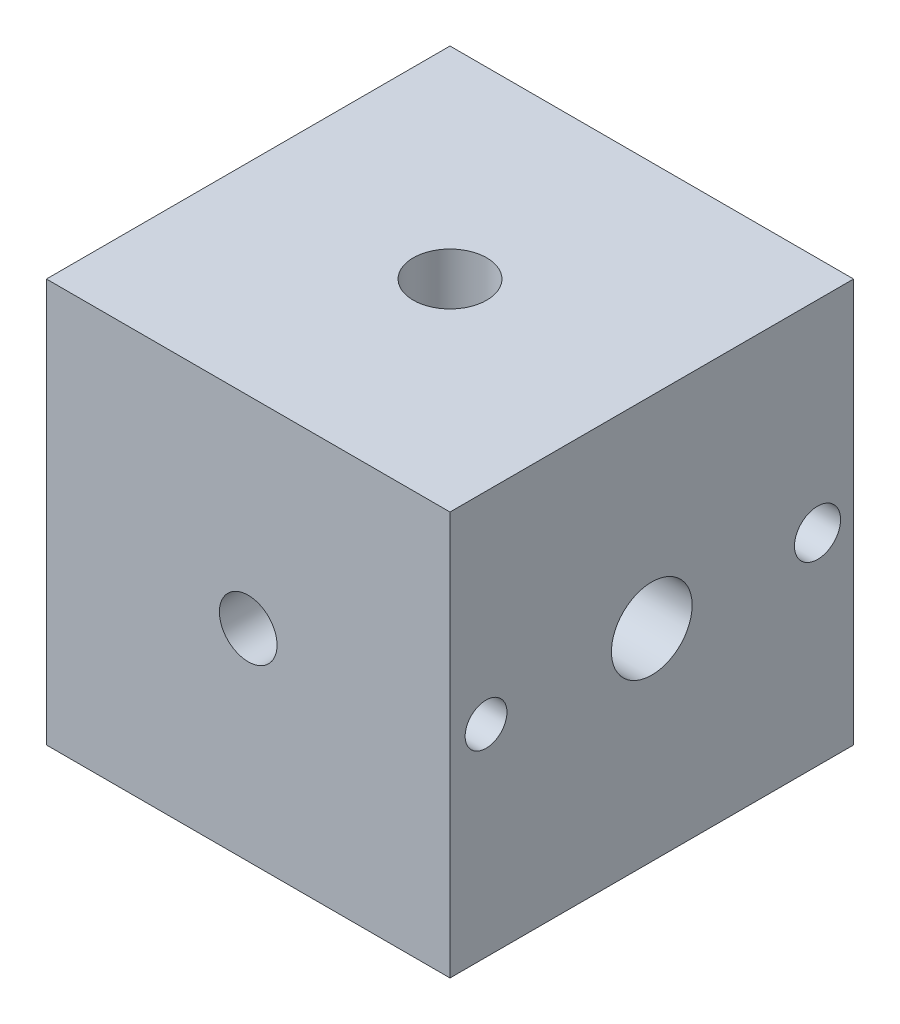
ISO-10303-21;
HEADER;
FILE_DESCRIPTION(('STEP AP214'),'2;1');
FILE_NAME('part.step','',(''),(''),'','','');
FILE_SCHEMA(('AUTOMOTIVE_DESIGN { 1 0 10303 214 1 1 1 1 }'));
ENDSEC;
DATA;
#1=APPLICATION_CONTEXT('core data for automotive mechanical design processes');
#2=APPLICATION_PROTOCOL_DEFINITION('international standard','automotive_design',2000,#1);
#3=PRODUCT_CONTEXT('',#1,'mechanical');
#4=PRODUCT('Part','Part','',(#3));
#5=PRODUCT_RELATED_PRODUCT_CATEGORY('part','',(#4));
#6=PRODUCT_DEFINITION_FORMATION('','',#4);
#7=PRODUCT_DEFINITION_CONTEXT('part definition',#1,'design');
#8=PRODUCT_DEFINITION('design','',#6,#7);
#9=PRODUCT_DEFINITION_SHAPE('','',#8);
#10=(LENGTH_UNIT() NAMED_UNIT(*) SI_UNIT(.MILLI.,.METRE.));
#11=(NAMED_UNIT(*) PLANE_ANGLE_UNIT() SI_UNIT($,.RADIAN.));
#12=(NAMED_UNIT(*) SI_UNIT($,.STERADIAN.) SOLID_ANGLE_UNIT());
#13=UNCERTAINTY_MEASURE_WITH_UNIT(LENGTH_MEASURE(1.E-05),#10,'distance_accuracy_value','');
#14=(GEOMETRIC_REPRESENTATION_CONTEXT(3) GLOBAL_UNCERTAINTY_ASSIGNED_CONTEXT((#13)) GLOBAL_UNIT_ASSIGNED_CONTEXT((#10,
#11,#12)) REPRESENTATION_CONTEXT('',''));
#15=CARTESIAN_POINT('',(0.,0.,0.));
#16=DIRECTION('',(0.,0.,1.));
#17=DIRECTION('',(1.,0.,0.));
#18=AXIS2_PLACEMENT_3D('',#15,#16,#17);
#19=CARTESIAN_POINT('',(8.,0.,11.5));
#20=DIRECTION('',(1.,0.,0.));
#21=DIRECTION('',(0.,1.,0.));
#22=AXIS2_PLACEMENT_3D('',#19,#20,#21);
#23=PLANE('',#22);
#24=CARTESIAN_POINT('',(8.,0.,11.5));
#25=DIRECTION('',(1.,0.,0.));
#26=DIRECTION('',(0.,0.,-1.));
#27=AXIS2_PLACEMENT_3D('',#24,#25,#26);
#28=CIRCLE('',#27,1.45);
#29=CARTESIAN_POINT('',(8.,0.,10.05));
#30=VERTEX_POINT('',#29);
#31=EDGE_CURVE('E11',#30,#30,#28,.T.);
#32=ORIENTED_EDGE('',*,*,#31,.T.);
#33=EDGE_LOOP('',(#32));
#34=FACE_BOUND('',#33,.T.);
#35=ADVANCED_FACE('F17',(#34),#23,.T.);
#36=CARTESIAN_POINT('',(6.,0.,0.));
#37=DIRECTION('',(1.,0.,0.));
#38=DIRECTION('',(0.,1.,0.));
#39=AXIS2_PLACEMENT_3D('',#36,#37,#38);
#40=PLANE('',#39);
#41=CARTESIAN_POINT('',(6.,0.,0.));
#42=DIRECTION('',(1.,0.,0.));
#43=DIRECTION('',(0.,0.,-1.));
#44=AXIS2_PLACEMENT_3D('',#41,#42,#43);
#45=CIRCLE('',#44,2.8);
#46=CARTESIAN_POINT('',(6.,0.,-2.8));
#47=VERTEX_POINT('',#46);
#48=EDGE_CURVE('E28',#47,#47,#45,.T.);
#49=ORIENTED_EDGE('',*,*,#48,.T.);
#50=EDGE_LOOP('',(#49));
#51=FACE_BOUND('',#50,.T.);
#52=ADVANCED_FACE('F279',(#51),#40,.T.);
#53=CARTESIAN_POINT('',(8.,0.,-11.5));
#54=DIRECTION('',(1.,0.,0.));
#55=DIRECTION('',(0.,1.,0.));
#56=AXIS2_PLACEMENT_3D('',#53,#54,#55);
#57=PLANE('',#56);
#58=CARTESIAN_POINT('',(8.,0.,-11.5));
#59=DIRECTION('',(1.,0.,0.));
#60=DIRECTION('',(0.,0.,-1.));
#61=AXIS2_PLACEMENT_3D('',#58,#59,#60);
#62=CIRCLE('',#61,1.6);
#63=CARTESIAN_POINT('',(8.,0.,-13.1));
#64=VERTEX_POINT('',#63);
#65=EDGE_CURVE('E209',#64,#64,#62,.T.);
#66=ORIENTED_EDGE('',*,*,#65,.T.);
#67=EDGE_LOOP('',(#66));
#68=FACE_BOUND('',#67,.T.);
#69=ADVANCED_FACE('F284',(#68),#57,.T.);
#70=CARTESIAN_POINT('',(0.,0.,1.995));
#71=DIRECTION('',(0.,0.,1.));
#72=DIRECTION('',(1.,0.,0.));
#73=AXIS2_PLACEMENT_3D('',#70,#71,#72);
#74=PLANE('',#73);
#75=DIRECTION('',(0.,-1.,0.));
#76=VECTOR('',#75,1.);
#77=CARTESIAN_POINT('',(-1.58823014705,28.,1.995));
#78=LINE('',#77,#76);
#79=CARTESIAN_POINT('',(-1.58823014705,1.215534861697,1.995));
#80=VERTEX_POINT('',#79);
#81=CARTESIAN_POINT('',(-1.58823014705,-1.215534861697,1.995));
#82=VERTEX_POINT('',#81);
#83=EDGE_CURVE('E199',#80,#82,#78,.T.);
#84=ORIENTED_EDGE('',*,*,#83,.F.);
#85=CARTESIAN_POINT('',(0.,0.,1.995));
#86=DIRECTION('',(0.,0.,1.));
#87=DIRECTION('',(1.,0.,0.));
#88=AXIS2_PLACEMENT_3D('',#85,#86,#87);
#89=CIRCLE('',#88,2.);
#90=EDGE_CURVE('E40',#80,#82,#89,.T.);
#91=ORIENTED_EDGE('',*,*,#90,.T.);
#92=EDGE_LOOP('',(#84,#91));
#93=FACE_BOUND('',#92,.T.);
#94=ADVANCED_FACE('F300',(#93),#74,.T.);
#95=CARTESIAN_POINT('',(0.,0.,1.995));
#96=DIRECTION('',(0.,0.,1.));
#97=DIRECTION('',(1.,0.,0.));
#98=AXIS2_PLACEMENT_3D('',#95,#96,#97);
#99=PLANE('',#98);
#100=CARTESIAN_POINT('',(0.,0.,1.995));
#101=DIRECTION('',(0.,0.,1.));
#102=DIRECTION('',(1.,0.,0.));
#103=AXIS2_PLACEMENT_3D('',#100,#101,#102);
#104=CIRCLE('',#103,2.);
#105=CARTESIAN_POINT('',(1.58823014705,-1.215534861697,1.995));
#106=VERTEX_POINT('',#105);
#107=CARTESIAN_POINT('',(1.58823014705,1.215534861697,1.995));
#108=VERTEX_POINT('',#107);
#109=EDGE_CURVE('E204',#106,#108,#104,.T.);
#110=ORIENTED_EDGE('',*,*,#109,.T.);
#111=DIRECTION('',(0.,-1.,0.));
#112=VECTOR('',#111,1.);
#113=CARTESIAN_POINT('',(1.58823014705,28.,1.995));
#114=LINE('',#113,#112);
#115=EDGE_CURVE('E156',#108,#106,#114,.T.);
#116=ORIENTED_EDGE('',*,*,#115,.T.);
#117=EDGE_LOOP('',(#110,#116));
#118=FACE_BOUND('',#117,.T.);
#119=ADVANCED_FACE('F230',(#118),#99,.T.);
#120=CARTESIAN_POINT('',(8.,0.,11.5));
#121=DIRECTION('',(1.,0.,0.));
#122=DIRECTION('',(0.,0.,-1.));
#123=AXIS2_PLACEMENT_3D('',#120,#121,#122);
#124=CYLINDRICAL_SURFACE('',#123,1.45);
#125=CARTESIAN_POINT('',(14.,0.,11.5));
#126=DIRECTION('',(1.,0.,0.));
#127=DIRECTION('',(0.,0.,-1.));
#128=AXIS2_PLACEMENT_3D('',#125,#126,#127);
#129=CIRCLE('',#128,1.45);
#130=CARTESIAN_POINT('',(14.,0.,10.05));
#131=VERTEX_POINT('',#130);
#132=EDGE_CURVE('E160',#131,#131,#129,.T.);
#133=ORIENTED_EDGE('',*,*,#132,.T.);
#134=EDGE_LOOP('',(#133));
#135=FACE_BOUND('',#134,.T.);
#136=ORIENTED_EDGE('',*,*,#31,.F.);
#137=EDGE_LOOP('',(#136));
#138=FACE_BOUND('',#137,.T.);
#139=ADVANCED_FACE('F288',(#135,#138),#124,.F.);
#140=CARTESIAN_POINT('',(6.,0.,0.));
#141=DIRECTION('',(1.,0.,0.));
#142=DIRECTION('',(0.,0.,-1.));
#143=AXIS2_PLACEMENT_3D('',#140,#141,#142);
#144=CYLINDRICAL_SURFACE('',#143,2.8);
#145=CARTESIAN_POINT('',(14.,0.,0.));
#146=DIRECTION('',(1.,0.,0.));
#147=DIRECTION('',(0.,0.,-1.));
#148=AXIS2_PLACEMENT_3D('',#145,#146,#147);
#149=CIRCLE('',#148,2.8);
#150=CARTESIAN_POINT('',(14.,0.,-2.8));
#151=VERTEX_POINT('',#150);
#152=EDGE_CURVE('E192',#151,#151,#149,.T.);
#153=ORIENTED_EDGE('',*,*,#152,.T.);
#154=EDGE_LOOP('',(#153));
#155=FACE_BOUND('',#154,.T.);
#156=ORIENTED_EDGE('',*,*,#48,.F.);
#157=EDGE_LOOP('',(#156));
#158=FACE_BOUND('',#157,.T.);
#159=ADVANCED_FACE('F290',(#155,#158),#144,.F.);
#160=CARTESIAN_POINT('',(8.,0.,-11.5));
#161=DIRECTION('',(1.,0.,0.));
#162=DIRECTION('',(0.,0.,-1.));
#163=AXIS2_PLACEMENT_3D('',#160,#161,#162);
#164=CYLINDRICAL_SURFACE('',#163,1.6);
#165=CARTESIAN_POINT('',(14.,0.,-11.5));
#166=DIRECTION('',(1.,0.,0.));
#167=DIRECTION('',(0.,0.,-1.));
#168=AXIS2_PLACEMENT_3D('',#165,#166,#167);
#169=CIRCLE('',#168,1.6);
#170=CARTESIAN_POINT('',(14.,0.,-13.1));
#171=VERTEX_POINT('',#170);
#172=EDGE_CURVE('E188',#171,#171,#169,.T.);
#173=ORIENTED_EDGE('',*,*,#172,.T.);
#174=EDGE_LOOP('',(#173));
#175=FACE_BOUND('',#174,.T.);
#176=ORIENTED_EDGE('',*,*,#65,.F.);
#177=EDGE_LOOP('',(#176));
#178=FACE_BOUND('',#177,.T.);
#179=ADVANCED_FACE('F297',(#175,#178),#164,.F.);
#180=CARTESIAN_POINT('',(-8.,0.,11.5));
#181=DIRECTION('',(1.,0.,0.));
#182=DIRECTION('',(0.,1.,0.));
#183=AXIS2_PLACEMENT_3D('',#180,#181,#182);
#184=PLANE('',#183);
#185=CARTESIAN_POINT('',(-8.,0.,11.5));
#186=DIRECTION('',(1.,0.,0.));
#187=DIRECTION('',(0.,0.,-1.));
#188=AXIS2_PLACEMENT_3D('',#185,#186,#187);
#189=CIRCLE('',#188,1.45);
#190=CARTESIAN_POINT('',(-8.,0.,10.05));
#191=VERTEX_POINT('',#190);
#192=EDGE_CURVE('E184',#191,#191,#189,.T.);
#193=ORIENTED_EDGE('',*,*,#192,.F.);
#194=EDGE_LOOP('',(#193));
#195=FACE_BOUND('',#194,.T.);
#196=ADVANCED_FACE('F313',(#195),#184,.F.);
#197=CARTESIAN_POINT('',(-6.,0.,0.));
#198=DIRECTION('',(1.,0.,0.));
#199=DIRECTION('',(0.,1.,0.));
#200=AXIS2_PLACEMENT_3D('',#197,#198,#199);
#201=PLANE('',#200);
#202=CARTESIAN_POINT('',(-6.,0.,0.));
#203=DIRECTION('',(1.,0.,0.));
#204=DIRECTION('',(0.,0.,-1.));
#205=AXIS2_PLACEMENT_3D('',#202,#203,#204);
#206=CIRCLE('',#205,2.8);
#207=CARTESIAN_POINT('',(-6.,0.,-2.8));
#208=VERTEX_POINT('',#207);
#209=EDGE_CURVE('E180',#208,#208,#206,.T.);
#210=ORIENTED_EDGE('',*,*,#209,.F.);
#211=EDGE_LOOP('',(#210));
#212=FACE_BOUND('',#211,.T.);
#213=ADVANCED_FACE('F273',(#212),#201,.F.);
#214=CARTESIAN_POINT('',(-8.,0.,-11.5));
#215=DIRECTION('',(1.,0.,0.));
#216=DIRECTION('',(0.,1.,0.));
#217=AXIS2_PLACEMENT_3D('',#214,#215,#216);
#218=PLANE('',#217);
#219=CARTESIAN_POINT('',(-8.,0.,-11.5));
#220=DIRECTION('',(1.,0.,0.));
#221=DIRECTION('',(0.,0.,-1.));
#222=AXIS2_PLACEMENT_3D('',#219,#220,#221);
#223=CIRCLE('',#222,1.6);
#224=CARTESIAN_POINT('',(-8.,0.,-13.1));
#225=VERTEX_POINT('',#224);
#226=EDGE_CURVE('E176',#225,#225,#223,.T.);
#227=ORIENTED_EDGE('',*,*,#226,.F.);
#228=EDGE_LOOP('',(#227));
#229=FACE_BOUND('',#228,.T.);
#230=ADVANCED_FACE('F262',(#229),#218,.F.);
#231=CARTESIAN_POINT('',(0.,0.,1.995));
#232=DIRECTION('',(0.,0.,1.));
#233=DIRECTION('',(1.,0.,0.));
#234=AXIS2_PLACEMENT_3D('',#231,#232,#233);
#235=CYLINDRICAL_SURFACE('',#234,2.);
#236=CARTESIAN_POINT('',(0.,0.,14.));
#237=DIRECTION('',(0.,0.,1.));
#238=DIRECTION('',(1.,0.,0.));
#239=AXIS2_PLACEMENT_3D('',#236,#237,#238);
#240=CIRCLE('',#239,2.);
#241=CARTESIAN_POINT('',(2.,0.,14.));
#242=VERTEX_POINT('',#241);
#243=EDGE_CURVE('E144',#242,#242,#240,.T.);
#244=ORIENTED_EDGE('',*,*,#243,.T.);
#245=EDGE_LOOP('',(#244));
#246=FACE_BOUND('',#245,.T.);
#247=CARTESIAN_POINT('',(1.588230900719,1.215533876945,1.9949994));
#248=CARTESIAN_POINT('',(1.493312807921,1.339554976545,2.070564258826));
#249=CARTESIAN_POINT('',(1.385431224227,1.456436773732,2.147595542997));
#250=CARTESIAN_POINT('',(1.263773072387,1.565953731919,2.223715300103));
#251=CARTESIAN_POINT('',(1.127135862466,1.666765698737,2.296627463782));
#252=CARTESIAN_POINT('',(0.974332047042,1.756407367835,2.363280245736));
#253=CARTESIAN_POINT('',(0.759806532102,1.850705495804,2.434634173071));
#254=CARTESIAN_POINT('',(0.713642348034,1.869413645077,2.448873442039));
#255=CARTESIAN_POINT('',(0.666356309088,1.886955096084,2.462293341311));
#256=CARTESIAN_POINT('',(0.617990242128,1.903240429293,2.474807618467));
#257=CARTESIAN_POINT('',(0.568590419616,1.918183007082,2.486333186612));
#258=CARTESIAN_POINT('',(0.43653866828,1.953607893015,2.513740462512));
#259=CARTESIAN_POINT('',(0.352162802534,1.971801259837,2.527909039614));
#260=CARTESIAN_POINT('',(0.265680808194,1.985793325601,2.538857059869));
#261=CARTESIAN_POINT('',(0.177724418329,1.995253066588,2.546277216925));
#262=CARTESIAN_POINT('',(0.08894461650089,2.,2.55));
#263=CARTESIAN_POINT('',(-0.06018330789624,2.,2.55));
#264=CARTESIAN_POINT('',(-0.120340718163,1.997826754698,2.54829552778));
#265=CARTESIAN_POINT('',(-0.180245197546,1.993483896786,2.544889276931));
#266=CARTESIAN_POINT('',(-0.239670685801,1.987011632494,2.539818415521));
#267=CARTESIAN_POINT('',(-0.298394007621,1.978487206757,2.533153897218));
#268=CARTESIAN_POINT('',(-0.437161607598,1.953371385737,2.513578223012));
#269=CARTESIAN_POINT('',(-0.516223233267,1.934933811347,2.499247800117));
#270=CARTESIAN_POINT('',(-0.59311635548,1.912986386552,2.482261187027));
#271=CARTESIAN_POINT('',(-0.667598831076,1.88783346075,2.462909493862));
#272=CARTESIAN_POINT('',(-0.739453532206,1.85981330012,2.441517393262));
#273=CARTESIAN_POINT('',(-0.977099881779,1.754781540579,2.362071600548));
#274=CARTESIAN_POINT('',(-1.129117061312,1.665302414961,2.295569379453));
#275=CARTESIAN_POINT('',(-1.265095506343,1.564762129299,2.222887258901));
#276=CARTESIAN_POINT('',(-1.386212156984,1.455590172231,2.147037749394));
#277=CARTESIAN_POINT('',(-1.493655992845,1.339106567076,2.070291047266));
#278=CARTESIAN_POINT('',(-1.588230900721,1.215533876942,1.994999399999));
#279=B_SPLINE_CURVE_WITH_KNOTS('',6,(#247,#248,#249,#250,#251,#252,#253,#254,#255,#256,#257,
#258,#259,#260,#261,#262,#263,#264,#265,#266,#267,#268,#269,#270,#271,#272,#273,#274,#275,#276,
#277,#278),.UNSPECIFIED.,.F.,.F.,(7,5,5,5,5,5,7),(0.,0.294897558214,0.373188054092,
0.500094267858,0.585963835208,0.706242041356,1.),.UNSPECIFIED.);
#280=EDGE_CURVE('E20',#108,#80,#279,.T.);
#281=ORIENTED_EDGE('',*,*,#280,.F.);
#282=ORIENTED_EDGE('',*,*,#109,.F.);
#283=CARTESIAN_POINT('',(-1.588230900719,-1.215533876945,1.9949994));
#284=CARTESIAN_POINT('',(-1.493312807921,-1.339554976545,2.070564258827));
#285=CARTESIAN_POINT('',(-1.385431224227,-1.456436773732,2.147595542996));
#286=CARTESIAN_POINT('',(-1.263773072387,-1.565953731919,2.223715300103));
#287=CARTESIAN_POINT('',(-1.127135862467,-1.666765698737,2.296627463782));
#288=CARTESIAN_POINT('',(-0.974332047042,-1.756407367835,2.363280245736));
#289=CARTESIAN_POINT('',(-0.759806532129,-1.850705495792,2.434634173062));
#290=CARTESIAN_POINT('',(-0.713642348023,-1.869413645078,2.44887344204));
#291=CARTESIAN_POINT('',(-0.666356309058,-1.886955096095,2.462293341319));
#292=CARTESIAN_POINT('',(-0.617990242122,-1.903240429297,2.47480761847));
#293=CARTESIAN_POINT('',(-0.56859041965,-1.918183007073,2.486333186605));
#294=CARTESIAN_POINT('',(-0.43653866828,-1.953607893016,2.513740462512));
#295=CARTESIAN_POINT('',(-0.352162802534,-1.971801259837,2.527909039614));
#296=CARTESIAN_POINT('',(-0.265680808194,-1.985793325601,2.538857059869));
#297=CARTESIAN_POINT('',(-0.177724418329,-1.995253066588,2.546277216925));
#298=CARTESIAN_POINT('',(-0.08894461650087,-2.,2.55));
#299=CARTESIAN_POINT('',(0.06018330786294,-2.,2.55));
#300=CARTESIAN_POINT('',(0.120340718167,-1.9978267547,2.548295527782));
#301=CARTESIAN_POINT('',(0.180245197575,-1.993483896784,2.544889276929));
#302=CARTESIAN_POINT('',(0.239670685811,-1.98701163249,2.539818415519));
#303=CARTESIAN_POINT('',(0.298394007597,-1.978487206762,2.533153897222));
#304=CARTESIAN_POINT('',(0.437161607598,-1.953371385737,2.513578223012));
#305=CARTESIAN_POINT('',(0.516223233267,-1.934933811347,2.499247800117));
#306=CARTESIAN_POINT('',(0.59311635548,-1.912986386552,2.482261187027));
#307=CARTESIAN_POINT('',(0.667598831076,-1.88783346075,2.462909493862));
#308=CARTESIAN_POINT('',(0.739453532206,-1.85981330012,2.441517393262));
#309=CARTESIAN_POINT('',(0.977099881779,-1.754781540579,2.362071600548));
#310=CARTESIAN_POINT('',(1.129117061312,-1.665302414961,2.295569379453));
#311=CARTESIAN_POINT('',(1.265095506343,-1.564762129299,2.222887258901));
#312=CARTESIAN_POINT('',(1.386212156984,-1.455590172231,2.147037749394));
#313=CARTESIAN_POINT('',(1.493655992845,-1.339106567076,2.070291047266));
#314=CARTESIAN_POINT('',(1.588230900721,-1.215533876942,1.994999399999));
#315=B_SPLINE_CURVE_WITH_KNOTS('',6,(#283,#284,#285,#286,#287,#288,#289,#290,#291,#292,#293,
#294,#295,#296,#297,#298,#299,#300,#301,#302,#303,#304,#305,#306,#307,#308,#309,#310,#311,#312,
#313,#314),.UNSPECIFIED.,.F.,.F.,(7,5,5,5,5,5,7),(0.,0.294897558595,0.373188054526,
0.500094268295,0.585963835599,0.706242041633,1.),.UNSPECIFIED.);
#316=EDGE_CURVE('E203',#82,#106,#315,.T.);
#317=ORIENTED_EDGE('',*,*,#316,.F.);
#318=ORIENTED_EDGE('',*,*,#90,.F.);
#319=EDGE_LOOP('',(#281,#282,#317,#318));
#320=FACE_BOUND('',#319,.T.);
#321=ADVANCED_FACE('F231',(#246,#320),#235,.F.);
#322=CARTESIAN_POINT('',(0.,28.,0.));
#323=DIRECTION('',(0.,-1.,0.));
#324=DIRECTION('',(1.,0.,0.));
#325=AXIS2_PLACEMENT_3D('',#322,#323,#324);
#326=CYLINDRICAL_SURFACE('',#325,2.55);
#327=CARTESIAN_POINT('',(0.,-14.,0.));
#328=DIRECTION('',(0.,-1.,0.));
#329=DIRECTION('',(1.,0.,0.));
#330=AXIS2_PLACEMENT_3D('',#327,#328,#329);
#331=CIRCLE('',#330,2.55);
#332=CARTESIAN_POINT('',(2.55,-14.,0.));
#333=VERTEX_POINT('',#332);
#334=EDGE_CURVE('E128',#333,#333,#331,.T.);
#335=ORIENTED_EDGE('',*,*,#334,.T.);
#336=EDGE_LOOP('',(#335));
#337=FACE_BOUND('',#336,.T.);
#338=ORIENTED_EDGE('',*,*,#115,.F.);
#339=ORIENTED_EDGE('',*,*,#280,.T.);
#340=ORIENTED_EDGE('',*,*,#83,.T.);
#341=ORIENTED_EDGE('',*,*,#316,.T.);
#342=EDGE_LOOP('',(#338,#339,#340,#341));
#343=FACE_BOUND('',#342,.T.);
#344=CARTESIAN_POINT('',(0.,14.,0.));
#345=DIRECTION('',(0.,-1.,0.));
#346=DIRECTION('',(1.,0.,0.));
#347=AXIS2_PLACEMENT_3D('',#344,#345,#346);
#348=CIRCLE('',#347,2.55);
#349=CARTESIAN_POINT('',(2.55,14.,0.));
#350=VERTEX_POINT('',#349);
#351=EDGE_CURVE('E172',#350,#350,#348,.T.);
#352=ORIENTED_EDGE('',*,*,#351,.F.);
#353=EDGE_LOOP('',(#352));
#354=FACE_BOUND('',#353,.T.);
#355=ADVANCED_FACE('F226',(#337,#343,#354),#326,.F.);
#356=CARTESIAN_POINT('',(14.,-14.,-14.));
#357=DIRECTION('',(1.,0.,0.));
#358=DIRECTION('',(0.,1.,0.));
#359=AXIS2_PLACEMENT_3D('',#356,#357,#358);
#360=PLANE('',#359);
#361=ORIENTED_EDGE('',*,*,#132,.F.);
#362=EDGE_LOOP('',(#361));
#363=FACE_BOUND('',#362,.T.);
#364=ORIENTED_EDGE('',*,*,#152,.F.);
#365=EDGE_LOOP('',(#364));
#366=FACE_BOUND('',#365,.T.);
#367=ORIENTED_EDGE('',*,*,#172,.F.);
#368=EDGE_LOOP('',(#367));
#369=FACE_BOUND('',#368,.T.);
#370=DIRECTION('',(0.,0.,1.));
#371=VECTOR('',#370,1.);
#372=CARTESIAN_POINT('',(14.,-14.,-14.));
#373=LINE('',#372,#371);
#374=CARTESIAN_POINT('',(14.,-14.,-14.));
#375=VERTEX_POINT('',#374);
#376=CARTESIAN_POINT('',(14.,-14.,14.));
#377=VERTEX_POINT('',#376);
#378=EDGE_CURVE('E98',#375,#377,#373,.T.);
#379=ORIENTED_EDGE('',*,*,#378,.F.);
#380=DIRECTION('',(0.,1.,0.));
#381=VECTOR('',#380,1.);
#382=CARTESIAN_POINT('',(14.,-14.,-14.));
#383=LINE('',#382,#381);
#384=CARTESIAN_POINT('',(14.,14.,-14.));
#385=VERTEX_POINT('',#384);
#386=EDGE_CURVE('E143',#375,#385,#383,.T.);
#387=ORIENTED_EDGE('',*,*,#386,.T.);
#388=DIRECTION('',(0.,0.,1.));
#389=VECTOR('',#388,1.);
#390=CARTESIAN_POINT('',(14.,14.,-14.));
#391=LINE('',#390,#389);
#392=CARTESIAN_POINT('',(14.,14.,14.));
#393=VERTEX_POINT('',#392);
#394=EDGE_CURVE('E169',#385,#393,#391,.T.);
#395=ORIENTED_EDGE('',*,*,#394,.T.);
#396=DIRECTION('',(0.,1.,0.));
#397=VECTOR('',#396,1.);
#398=CARTESIAN_POINT('',(14.,-14.,14.));
#399=LINE('',#398,#397);
#400=EDGE_CURVE('E132',#377,#393,#399,.T.);
#401=ORIENTED_EDGE('',*,*,#400,.F.);
#402=EDGE_LOOP('',(#379,#387,#395,#401));
#403=FACE_BOUND('',#402,.T.);
#404=ADVANCED_FACE('F270',(#363,#366,#369,#403),#360,.T.);
#405=CARTESIAN_POINT('',(-14.01,0.,11.5));
#406=DIRECTION('',(1.,0.,0.));
#407=DIRECTION('',(0.,0.,-1.));
#408=AXIS2_PLACEMENT_3D('',#405,#406,#407);
#409=CYLINDRICAL_SURFACE('',#408,1.45);
#410=ORIENTED_EDGE('',*,*,#192,.T.);
#411=EDGE_LOOP('',(#410));
#412=FACE_BOUND('',#411,.T.);
#413=CARTESIAN_POINT('',(-14.,0.,11.5));
#414=DIRECTION('',(1.,0.,0.));
#415=DIRECTION('',(0.,0.,-1.));
#416=AXIS2_PLACEMENT_3D('',#413,#414,#415);
#417=CIRCLE('',#416,1.45);
#418=CARTESIAN_POINT('',(-14.,0.,10.05));
#419=VERTEX_POINT('',#418);
#420=EDGE_CURVE('E148',#419,#419,#417,.T.);
#421=ORIENTED_EDGE('',*,*,#420,.F.);
#422=EDGE_LOOP('',(#421));
#423=FACE_BOUND('',#422,.T.);
#424=ADVANCED_FACE('F322',(#412,#423),#409,.F.);
#425=CARTESIAN_POINT('',(-14.01,0.,0.));
#426=DIRECTION('',(1.,0.,0.));
#427=DIRECTION('',(0.,0.,-1.));
#428=AXIS2_PLACEMENT_3D('',#425,#426,#427);
#429=CYLINDRICAL_SURFACE('',#428,2.8);
#430=ORIENTED_EDGE('',*,*,#209,.T.);
#431=EDGE_LOOP('',(#430));
#432=FACE_BOUND('',#431,.T.);
#433=CARTESIAN_POINT('',(-14.,0.,0.));
#434=DIRECTION('',(1.,0.,0.));
#435=DIRECTION('',(0.,0.,-1.));
#436=AXIS2_PLACEMENT_3D('',#433,#434,#435);
#437=CIRCLE('',#436,2.8);
#438=CARTESIAN_POINT('',(-14.,0.,-2.8));
#439=VERTEX_POINT('',#438);
#440=EDGE_CURVE('E138',#439,#439,#437,.T.);
#441=ORIENTED_EDGE('',*,*,#440,.F.);
#442=EDGE_LOOP('',(#441));
#443=FACE_BOUND('',#442,.T.);
#444=ADVANCED_FACE('F326',(#432,#443),#429,.F.);
#445=CARTESIAN_POINT('',(-14.01,0.,-11.5));
#446=DIRECTION('',(1.,0.,0.));
#447=DIRECTION('',(0.,0.,-1.));
#448=AXIS2_PLACEMENT_3D('',#445,#446,#447);
#449=CYLINDRICAL_SURFACE('',#448,1.6);
#450=ORIENTED_EDGE('',*,*,#226,.T.);
#451=EDGE_LOOP('',(#450));
#452=FACE_BOUND('',#451,.T.);
#453=CARTESIAN_POINT('',(-14.,0.,-11.5));
#454=DIRECTION('',(1.,0.,0.));
#455=DIRECTION('',(0.,0.,-1.));
#456=AXIS2_PLACEMENT_3D('',#453,#454,#455);
#457=CIRCLE('',#456,1.6);
#458=CARTESIAN_POINT('',(-14.,0.,-13.1));
#459=VERTEX_POINT('',#458);
#460=EDGE_CURVE('E113',#459,#459,#457,.T.);
#461=ORIENTED_EDGE('',*,*,#460,.F.);
#462=EDGE_LOOP('',(#461));
#463=FACE_BOUND('',#462,.T.);
#464=ADVANCED_FACE('F329',(#452,#463),#449,.F.);
#465=CARTESIAN_POINT('',(-14.,14.,-14.));
#466=DIRECTION('',(0.,1.,0.));
#467=DIRECTION('',(1.,0.,0.));
#468=AXIS2_PLACEMENT_3D('',#465,#466,#467);
#469=PLANE('',#468);
#470=ORIENTED_EDGE('',*,*,#351,.T.);
#471=EDGE_LOOP('',(#470));
#472=FACE_BOUND('',#471,.T.);
#473=DIRECTION('',(1.,0.,0.));
#474=VECTOR('',#473,1.);
#475=CARTESIAN_POINT('',(-14.,14.,-14.));
#476=LINE('',#475,#474);
#477=CARTESIAN_POINT('',(-14.,14.,-14.));
#478=VERTEX_POINT('',#477);
#479=EDGE_CURVE('E139',#478,#385,#476,.T.);
#480=ORIENTED_EDGE('',*,*,#479,.F.);
#481=DIRECTION('',(0.,0.,1.));
#482=VECTOR('',#481,1.);
#483=CARTESIAN_POINT('',(-14.,14.,-14.));
#484=LINE('',#483,#482);
#485=CARTESIAN_POINT('',(-14.,14.,14.));
#486=VERTEX_POINT('',#485);
#487=EDGE_CURVE('E120',#478,#486,#484,.T.);
#488=ORIENTED_EDGE('',*,*,#487,.T.);
#489=DIRECTION('',(1.,0.,0.));
#490=VECTOR('',#489,1.);
#491=CARTESIAN_POINT('',(-14.,14.,14.));
#492=LINE('',#491,#490);
#493=EDGE_CURVE('E117',#486,#393,#492,.T.);
#494=ORIENTED_EDGE('',*,*,#493,.T.);
#495=ORIENTED_EDGE('',*,*,#394,.F.);
#496=EDGE_LOOP('',(#480,#488,#494,#495));
#497=FACE_BOUND('',#496,.T.);
#498=ADVANCED_FACE('F334',(#472,#497),#469,.T.);
#499=CARTESIAN_POINT('',(-14.,-14.,-14.));
#500=DIRECTION('',(0.,0.,1.));
#501=DIRECTION('',(1.,0.,0.));
#502=AXIS2_PLACEMENT_3D('',#499,#500,#501);
#503=PLANE('',#502);
#504=ORIENTED_EDGE('',*,*,#479,.T.);
#505=ORIENTED_EDGE('',*,*,#386,.F.);
#506=DIRECTION('',(1.,0.,0.));
#507=VECTOR('',#506,1.);
#508=CARTESIAN_POINT('',(-14.,-14.,-14.));
#509=LINE('',#508,#507);
#510=CARTESIAN_POINT('',(-14.,-14.,-14.));
#511=VERTEX_POINT('',#510);
#512=EDGE_CURVE('E103',#511,#375,#509,.T.);
#513=ORIENTED_EDGE('',*,*,#512,.F.);
#514=DIRECTION('',(0.,1.,0.));
#515=VECTOR('',#514,1.);
#516=CARTESIAN_POINT('',(-14.,-14.,-14.));
#517=LINE('',#516,#515);
#518=EDGE_CURVE('E111',#511,#478,#517,.T.);
#519=ORIENTED_EDGE('',*,*,#518,.T.);
#520=EDGE_LOOP('',(#504,#505,#513,#519));
#521=FACE_BOUND('',#520,.T.);
#522=ADVANCED_FACE('F356',(#521),#503,.F.);
#523=CARTESIAN_POINT('',(-14.,-14.,14.));
#524=DIRECTION('',(0.,0.,1.));
#525=DIRECTION('',(1.,0.,0.));
#526=AXIS2_PLACEMENT_3D('',#523,#524,#525);
#527=PLANE('',#526);
#528=ORIENTED_EDGE('',*,*,#243,.F.);
#529=EDGE_LOOP('',(#528));
#530=FACE_BOUND('',#529,.T.);
#531=DIRECTION('',(0.,1.,0.));
#532=VECTOR('',#531,1.);
#533=CARTESIAN_POINT('',(-14.,-14.,14.));
#534=LINE('',#533,#532);
#535=CARTESIAN_POINT('',(-14.,-14.,14.));
#536=VERTEX_POINT('',#535);
#537=EDGE_CURVE('E109',#536,#486,#534,.T.);
#538=ORIENTED_EDGE('',*,*,#537,.F.);
#539=DIRECTION('',(1.,0.,0.));
#540=VECTOR('',#539,1.);
#541=CARTESIAN_POINT('',(-14.,-14.,14.));
#542=LINE('',#541,#540);
#543=EDGE_CURVE('E91',#536,#377,#542,.T.);
#544=ORIENTED_EDGE('',*,*,#543,.T.);
#545=ORIENTED_EDGE('',*,*,#400,.T.);
#546=ORIENTED_EDGE('',*,*,#493,.F.);
#547=EDGE_LOOP('',(#538,#544,#545,#546));
#548=FACE_BOUND('',#547,.T.);
#549=ADVANCED_FACE('F115',(#530,#548),#527,.T.);
#550=CARTESIAN_POINT('',(-14.,-14.,-14.));
#551=DIRECTION('',(0.,1.,0.));
#552=DIRECTION('',(1.,0.,0.));
#553=AXIS2_PLACEMENT_3D('',#550,#551,#552);
#554=PLANE('',#553);
#555=ORIENTED_EDGE('',*,*,#334,.F.);
#556=EDGE_LOOP('',(#555));
#557=FACE_BOUND('',#556,.T.);
#558=ORIENTED_EDGE('',*,*,#378,.T.);
#559=ORIENTED_EDGE('',*,*,#543,.F.);
#560=DIRECTION('',(0.,0.,1.));
#561=VECTOR('',#560,1.);
#562=CARTESIAN_POINT('',(-14.,-14.,-14.));
#563=LINE('',#562,#561);
#564=EDGE_CURVE('E95',#511,#536,#563,.T.);
#565=ORIENTED_EDGE('',*,*,#564,.F.);
#566=ORIENTED_EDGE('',*,*,#512,.T.);
#567=EDGE_LOOP('',(#558,#559,#565,#566));
#568=FACE_BOUND('',#567,.T.);
#569=ADVANCED_FACE('F93',(#557,#568),#554,.F.);
#570=CARTESIAN_POINT('',(-14.,-14.,-14.));
#571=DIRECTION('',(1.,0.,0.));
#572=DIRECTION('',(0.,1.,0.));
#573=AXIS2_PLACEMENT_3D('',#570,#571,#572);
#574=PLANE('',#573);
#575=ORIENTED_EDGE('',*,*,#420,.T.);
#576=EDGE_LOOP('',(#575));
#577=FACE_BOUND('',#576,.T.);
#578=ORIENTED_EDGE('',*,*,#440,.T.);
#579=EDGE_LOOP('',(#578));
#580=FACE_BOUND('',#579,.T.);
#581=ORIENTED_EDGE('',*,*,#460,.T.);
#582=EDGE_LOOP('',(#581));
#583=FACE_BOUND('',#582,.T.);
#584=ORIENTED_EDGE('',*,*,#537,.T.);
#585=ORIENTED_EDGE('',*,*,#487,.F.);
#586=ORIENTED_EDGE('',*,*,#518,.F.);
#587=ORIENTED_EDGE('',*,*,#564,.T.);
#588=EDGE_LOOP('',(#584,#585,#586,#587));
#589=FACE_BOUND('',#588,.T.);
#590=ADVANCED_FACE('F107',(#577,#580,#583,#589),#574,.F.);
#591=CLOSED_SHELL('',(#35,#52,#69,#94,#119,#139,#159,#179,#196,#213,#230,#321,#355,#404,#424,
#444,#464,#498,#522,#549,#569,#590));
#592=MANIFOLD_SOLID_BREP('B1',#591);
#593=ADVANCED_BREP_SHAPE_REPRESENTATION('',(#18,#592),#14);
#594=SHAPE_DEFINITION_REPRESENTATION(#9,#593);
ENDSEC;
END-ISO-10303-21;
